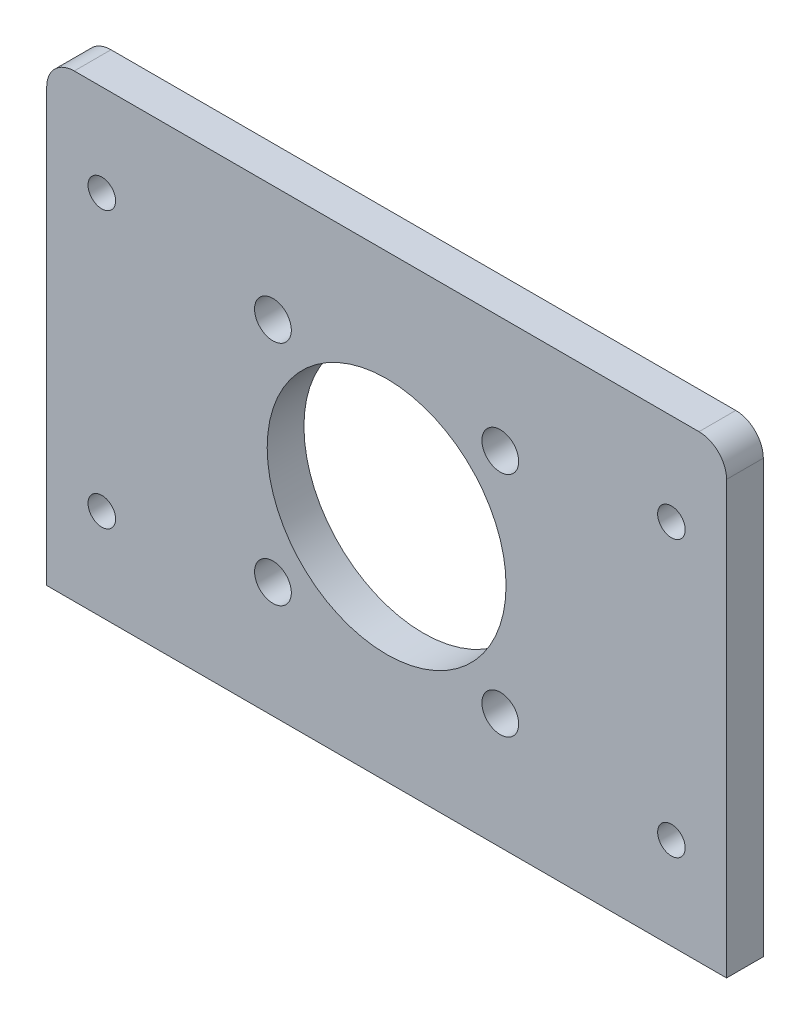
ISO-10303-21;
HEADER;
FILE_DESCRIPTION(('STEP AP214'),'2;1');
FILE_NAME('part.step','',(''),(''),'','','');
FILE_SCHEMA(('AUTOMOTIVE_DESIGN { 1 0 10303 214 1 1 1 1 }'));
ENDSEC;
DATA;
#1=APPLICATION_CONTEXT('core data for automotive mechanical design processes');
#2=APPLICATION_PROTOCOL_DEFINITION('international standard','automotive_design',2000,#1);
#3=PRODUCT_CONTEXT('',#1,'mechanical');
#4=PRODUCT('Part','Part','',(#3));
#5=PRODUCT_RELATED_PRODUCT_CATEGORY('part','',(#4));
#6=PRODUCT_DEFINITION_FORMATION('','',#4);
#7=PRODUCT_DEFINITION_CONTEXT('part definition',#1,'design');
#8=PRODUCT_DEFINITION('design','',#6,#7);
#9=PRODUCT_DEFINITION_SHAPE('','',#8);
#10=(LENGTH_UNIT() NAMED_UNIT(*) SI_UNIT(.MILLI.,.METRE.));
#11=(NAMED_UNIT(*) PLANE_ANGLE_UNIT() SI_UNIT($,.RADIAN.));
#12=(NAMED_UNIT(*) SI_UNIT($,.STERADIAN.) SOLID_ANGLE_UNIT());
#13=UNCERTAINTY_MEASURE_WITH_UNIT(LENGTH_MEASURE(1.E-05),#10,'distance_accuracy_value','');
#14=(GEOMETRIC_REPRESENTATION_CONTEXT(3) GLOBAL_UNCERTAINTY_ASSIGNED_CONTEXT((#13)) GLOBAL_UNIT_ASSIGNED_CONTEXT((#10,
#11,#12)) REPRESENTATION_CONTEXT('',''));
#15=CARTESIAN_POINT('',(0.,0.,0.));
#16=DIRECTION('',(0.,0.,1.));
#17=DIRECTION('',(1.,0.,0.));
#18=AXIS2_PLACEMENT_3D('',#15,#16,#17);
#19=CARTESIAN_POINT('',(37.,-25.,4.));
#20=DIRECTION('',(-1.,0.,0.));
#21=DIRECTION('',(0.,0.,1.));
#22=AXIS2_PLACEMENT_3D('',#19,#20,#21);
#23=PLANE('',#22);
#24=DIRECTION('',(0.,1.,0.));
#25=VECTOR('',#24,1.);
#26=CARTESIAN_POINT('',(37.,-25.,0.));
#27=LINE('',#26,#25);
#28=CARTESIAN_POINT('',(37.,-25.,0.));
#29=VERTEX_POINT('',#28);
#30=CARTESIAN_POINT('',(37.,22.,0.));
#31=VERTEX_POINT('',#30);
#32=EDGE_CURVE('E115',#29,#31,#27,.T.);
#33=ORIENTED_EDGE('',*,*,#32,.T.);
#34=DIRECTION('',(0.,0.,-1.));
#35=VECTOR('',#34,1.);
#36=CARTESIAN_POINT('',(37.,22.,4.));
#37=LINE('',#36,#35);
#38=CARTESIAN_POINT('',(37.,22.,4.));
#39=VERTEX_POINT('',#38);
#40=EDGE_CURVE('E59',#31,#39,#37,.F.);
#41=ORIENTED_EDGE('',*,*,#40,.T.);
#42=DIRECTION('',(0.,1.,0.));
#43=VECTOR('',#42,1.);
#44=CARTESIAN_POINT('',(37.,-25.,4.));
#45=LINE('',#44,#43);
#46=CARTESIAN_POINT('',(37.,-25.,4.));
#47=VERTEX_POINT('',#46);
#48=EDGE_CURVE('E123',#47,#39,#45,.T.);
#49=ORIENTED_EDGE('',*,*,#48,.F.);
#50=DIRECTION('',(0.,0.,-1.));
#51=VECTOR('',#50,1.);
#52=CARTESIAN_POINT('',(37.,-25.,4.));
#53=LINE('',#52,#51);
#54=EDGE_CURVE('E107',#47,#29,#53,.T.);
#55=ORIENTED_EDGE('',*,*,#54,.T.);
#56=EDGE_LOOP('',(#33,#41,#49,#55));
#57=FACE_BOUND('',#56,.T.);
#58=ADVANCED_FACE('F36',(#57),#23,.F.);
#59=CARTESIAN_POINT('',(-37.,25.,4.));
#60=DIRECTION('',(0.,-1.,0.));
#61=DIRECTION('',(0.,0.,-1.));
#62=AXIS2_PLACEMENT_3D('',#59,#60,#61);
#63=PLANE('',#62);
#64=DIRECTION('',(-1.,0.,0.));
#65=VECTOR('',#64,1.);
#66=CARTESIAN_POINT('',(-37.,25.,4.));
#67=LINE('',#66,#65);
#68=CARTESIAN_POINT('',(34.,25.,4.));
#69=VERTEX_POINT('',#68);
#70=CARTESIAN_POINT('',(-34.,25.,4.));
#71=VERTEX_POINT('',#70);
#72=EDGE_CURVE('E97',#69,#71,#67,.T.);
#73=ORIENTED_EDGE('',*,*,#72,.F.);
#74=DIRECTION('',(0.,0.,-1.));
#75=VECTOR('',#74,1.);
#76=CARTESIAN_POINT('',(34.,25.,4.));
#77=LINE('',#76,#75);
#78=CARTESIAN_POINT('',(34.,25.,0.));
#79=VERTEX_POINT('',#78);
#80=EDGE_CURVE('E126',#69,#79,#77,.T.);
#81=ORIENTED_EDGE('',*,*,#80,.T.);
#82=DIRECTION('',(-1.,0.,0.));
#83=VECTOR('',#82,1.);
#84=CARTESIAN_POINT('',(-37.,25.,0.));
#85=LINE('',#84,#83);
#86=CARTESIAN_POINT('',(-34.,25.,0.));
#87=VERTEX_POINT('',#86);
#88=EDGE_CURVE('E117',#79,#87,#85,.T.);
#89=ORIENTED_EDGE('',*,*,#88,.T.);
#90=DIRECTION('',(0.,0.,-1.));
#91=VECTOR('',#90,1.);
#92=CARTESIAN_POINT('',(-34.,25.,4.));
#93=LINE('',#92,#91);
#94=EDGE_CURVE('E106',#87,#71,#93,.F.);
#95=ORIENTED_EDGE('',*,*,#94,.T.);
#96=EDGE_LOOP('',(#73,#81,#89,#95));
#97=FACE_BOUND('',#96,.T.);
#98=ADVANCED_FACE('F139',(#97),#63,.F.);
#99=CARTESIAN_POINT('',(-37.,-25.,4.));
#100=DIRECTION('',(1.,0.,0.));
#101=DIRECTION('',(0.,0.,-1.));
#102=AXIS2_PLACEMENT_3D('',#99,#100,#101);
#103=PLANE('',#102);
#104=DIRECTION('',(0.,-1.,0.));
#105=VECTOR('',#104,1.);
#106=CARTESIAN_POINT('',(-37.,-25.,4.));
#107=LINE('',#106,#105);
#108=CARTESIAN_POINT('',(-37.,22.,4.));
#109=VERTEX_POINT('',#108);
#110=CARTESIAN_POINT('',(-37.,-25.,4.));
#111=VERTEX_POINT('',#110);
#112=EDGE_CURVE('E89',#109,#111,#107,.T.);
#113=ORIENTED_EDGE('',*,*,#112,.F.);
#114=DIRECTION('',(0.,0.,-1.));
#115=VECTOR('',#114,1.);
#116=CARTESIAN_POINT('',(-37.,22.,4.));
#117=LINE('',#116,#115);
#118=CARTESIAN_POINT('',(-37.,22.,0.));
#119=VERTEX_POINT('',#118);
#120=EDGE_CURVE('E11',#109,#119,#117,.T.);
#121=ORIENTED_EDGE('',*,*,#120,.T.);
#122=DIRECTION('',(0.,-1.,0.));
#123=VECTOR('',#122,1.);
#124=CARTESIAN_POINT('',(-37.,-25.,0.));
#125=LINE('',#124,#123);
#126=CARTESIAN_POINT('',(-37.,-25.,0.));
#127=VERTEX_POINT('',#126);
#128=EDGE_CURVE('E103',#119,#127,#125,.T.);
#129=ORIENTED_EDGE('',*,*,#128,.T.);
#130=DIRECTION('',(0.,0.,-1.));
#131=VECTOR('',#130,1.);
#132=CARTESIAN_POINT('',(-37.,-25.,4.));
#133=LINE('',#132,#131);
#134=EDGE_CURVE('E100',#111,#127,#133,.T.);
#135=ORIENTED_EDGE('',*,*,#134,.F.);
#136=EDGE_LOOP('',(#113,#121,#129,#135));
#137=FACE_BOUND('',#136,.T.);
#138=ADVANCED_FACE('F101',(#137),#103,.F.);
#139=CARTESIAN_POINT('',(-37.,-25.,4.));
#140=DIRECTION('',(0.,1.,0.));
#141=DIRECTION('',(0.,0.,1.));
#142=AXIS2_PLACEMENT_3D('',#139,#140,#141);
#143=PLANE('',#142);
#144=DIRECTION('',(1.,0.,0.));
#145=VECTOR('',#144,1.);
#146=CARTESIAN_POINT('',(-37.,-25.,0.));
#147=LINE('',#146,#145);
#148=EDGE_CURVE('E122',#127,#29,#147,.T.);
#149=ORIENTED_EDGE('',*,*,#148,.T.);
#150=ORIENTED_EDGE('',*,*,#54,.F.);
#151=DIRECTION('',(1.,0.,0.));
#152=VECTOR('',#151,1.);
#153=CARTESIAN_POINT('',(-37.,-25.,4.));
#154=LINE('',#153,#152);
#155=EDGE_CURVE('E93',#111,#47,#154,.T.);
#156=ORIENTED_EDGE('',*,*,#155,.F.);
#157=ORIENTED_EDGE('',*,*,#134,.T.);
#158=EDGE_LOOP('',(#149,#150,#156,#157));
#159=FACE_BOUND('',#158,.T.);
#160=ADVANCED_FACE('F109',(#159),#143,.F.);
#161=CARTESIAN_POINT('',(0.,0.,4.));
#162=DIRECTION('',(0.,0.,-1.));
#163=DIRECTION('',(-1.,0.,0.));
#164=AXIS2_PLACEMENT_3D('',#161,#162,#163);
#165=PLANE('',#164);
#166=CARTESIAN_POINT('',(31.,-15.,4.));
#167=DIRECTION('',(0.,0.,1.));
#168=DIRECTION('',(-1.,0.,0.));
#169=AXIS2_PLACEMENT_3D('',#166,#167,#168);
#170=CIRCLE('',#169,1.5);
#171=CARTESIAN_POINT('',(29.5,-15.,4.));
#172=VERTEX_POINT('',#171);
#173=EDGE_CURVE('E196',#172,#172,#170,.T.);
#174=ORIENTED_EDGE('',*,*,#173,.F.);
#175=EDGE_LOOP('',(#174));
#176=FACE_BOUND('',#175,.T.);
#177=CARTESIAN_POINT('',(-31.,-15.,4.));
#178=DIRECTION('',(0.,0.,-1.));
#179=DIRECTION('',(1.,0.,0.));
#180=AXIS2_PLACEMENT_3D('',#177,#178,#179);
#181=CIRCLE('',#180,1.5);
#182=CARTESIAN_POINT('',(-29.5,-15.,4.));
#183=VERTEX_POINT('',#182);
#184=EDGE_CURVE('E190',#183,#183,#181,.T.);
#185=ORIENTED_EDGE('',*,*,#184,.T.);
#186=EDGE_LOOP('',(#185));
#187=FACE_BOUND('',#186,.T.);
#188=CARTESIAN_POINT('',(31.,15.,4.));
#189=DIRECTION('',(0.,0.,-1.));
#190=DIRECTION('',(-1.,0.,0.));
#191=AXIS2_PLACEMENT_3D('',#188,#189,#190);
#192=CIRCLE('',#191,1.5);
#193=CARTESIAN_POINT('',(29.5,15.,4.));
#194=VERTEX_POINT('',#193);
#195=EDGE_CURVE('E184',#194,#194,#192,.T.);
#196=ORIENTED_EDGE('',*,*,#195,.T.);
#197=EDGE_LOOP('',(#196));
#198=FACE_BOUND('',#197,.T.);
#199=CARTESIAN_POINT('',(-31.,15.,4.));
#200=DIRECTION('',(0.,0.,1.));
#201=DIRECTION('',(1.,0.,0.));
#202=AXIS2_PLACEMENT_3D('',#199,#200,#201);
#203=CIRCLE('',#202,1.5);
#204=CARTESIAN_POINT('',(-29.5,15.,4.));
#205=VERTEX_POINT('',#204);
#206=EDGE_CURVE('E178',#205,#205,#203,.T.);
#207=ORIENTED_EDGE('',*,*,#206,.F.);
#208=EDGE_LOOP('',(#207));
#209=FACE_BOUND('',#208,.T.);
#210=CARTESIAN_POINT('',(-12.3743686707646,-12.3743686707646,4.));
#211=DIRECTION('',(0.,0.,1.));
#212=DIRECTION('',(-1.,0.,0.));
#213=AXIS2_PLACEMENT_3D('',#210,#211,#212);
#214=CIRCLE('',#213,2.);
#215=CARTESIAN_POINT('',(-14.3743686707646,-12.3743686707646,4.));
#216=VERTEX_POINT('',#215);
#217=EDGE_CURVE('E172',#216,#216,#214,.T.);
#218=ORIENTED_EDGE('',*,*,#217,.F.);
#219=EDGE_LOOP('',(#218));
#220=FACE_BOUND('',#219,.T.);
#221=CARTESIAN_POINT('',(12.3743686707646,-12.3743686707646,4.));
#222=DIRECTION('',(0.,0.,-1.));
#223=DIRECTION('',(1.,0.,0.));
#224=AXIS2_PLACEMENT_3D('',#221,#222,#223);
#225=CIRCLE('',#224,2.);
#226=CARTESIAN_POINT('',(14.3743686707646,-12.3743686707646,4.));
#227=VERTEX_POINT('',#226);
#228=EDGE_CURVE('E166',#227,#227,#225,.T.);
#229=ORIENTED_EDGE('',*,*,#228,.T.);
#230=EDGE_LOOP('',(#229));
#231=FACE_BOUND('',#230,.T.);
#232=CARTESIAN_POINT('',(-12.3743686707646,12.3743686707646,4.));
#233=DIRECTION('',(0.,0.,-1.));
#234=DIRECTION('',(-1.,0.,0.));
#235=AXIS2_PLACEMENT_3D('',#232,#233,#234);
#236=CIRCLE('',#235,2.);
#237=CARTESIAN_POINT('',(-14.3743686707646,12.3743686707646,4.));
#238=VERTEX_POINT('',#237);
#239=EDGE_CURVE('E160',#238,#238,#236,.T.);
#240=ORIENTED_EDGE('',*,*,#239,.T.);
#241=EDGE_LOOP('',(#240));
#242=FACE_BOUND('',#241,.T.);
#243=CARTESIAN_POINT('',(12.3743686707646,12.3743686707646,4.));
#244=DIRECTION('',(0.,0.,1.));
#245=DIRECTION('',(1.,0.,0.));
#246=AXIS2_PLACEMENT_3D('',#243,#244,#245);
#247=CIRCLE('',#246,2.);
#248=CARTESIAN_POINT('',(14.3743686707646,12.3743686707646,4.));
#249=VERTEX_POINT('',#248);
#250=EDGE_CURVE('E154',#249,#249,#247,.T.);
#251=ORIENTED_EDGE('',*,*,#250,.F.);
#252=EDGE_LOOP('',(#251));
#253=FACE_BOUND('',#252,.T.);
#254=CARTESIAN_POINT('',(0.,0.,4.));
#255=DIRECTION('',(0.,0.,1.));
#256=DIRECTION('',(1.,0.,0.));
#257=AXIS2_PLACEMENT_3D('',#254,#255,#256);
#258=CIRCLE('',#257,13.);
#259=CARTESIAN_POINT('',(13.,0.,4.));
#260=VERTEX_POINT('',#259);
#261=EDGE_CURVE('E148',#260,#260,#258,.T.);
#262=ORIENTED_EDGE('',*,*,#261,.F.);
#263=EDGE_LOOP('',(#262));
#264=FACE_BOUND('',#263,.T.);
#265=ORIENTED_EDGE('',*,*,#48,.T.);
#266=CARTESIAN_POINT('',(34.,22.,4.));
#267=DIRECTION('',(0.,0.,-1.));
#268=DIRECTION('',(-1.,0.,0.));
#269=AXIS2_PLACEMENT_3D('',#266,#267,#268);
#270=CIRCLE('',#269,3.);
#271=EDGE_CURVE('E44',#39,#69,#270,.F.);
#272=ORIENTED_EDGE('',*,*,#271,.T.);
#273=ORIENTED_EDGE('',*,*,#72,.T.);
#274=CARTESIAN_POINT('',(-34.,22.,4.));
#275=DIRECTION('',(0.,0.,-1.));
#276=DIRECTION('',(-1.,0.,0.));
#277=AXIS2_PLACEMENT_3D('',#274,#275,#276);
#278=CIRCLE('',#277,3.);
#279=EDGE_CURVE('E51',#71,#109,#278,.F.);
#280=ORIENTED_EDGE('',*,*,#279,.T.);
#281=ORIENTED_EDGE('',*,*,#112,.T.);
#282=ORIENTED_EDGE('',*,*,#155,.T.);
#283=EDGE_LOOP('',(#265,#272,#273,#280,#281,#282));
#284=FACE_BOUND('',#283,.T.);
#285=ADVANCED_FACE('F91',(#176,#187,#198,#209,#220,#231,#242,#253,#264,#284),#165,.F.);
#286=CARTESIAN_POINT('',(0.,0.,0.));
#287=DIRECTION('',(0.,0.,-1.));
#288=DIRECTION('',(-1.,0.,0.));
#289=AXIS2_PLACEMENT_3D('',#286,#287,#288);
#290=PLANE('',#289);
#291=CARTESIAN_POINT('',(31.,-15.,0.));
#292=DIRECTION('',(0.,0.,1.));
#293=DIRECTION('',(-1.,0.,0.));
#294=AXIS2_PLACEMENT_3D('',#291,#292,#293);
#295=CIRCLE('',#294,1.5);
#296=CARTESIAN_POINT('',(29.5,-15.,0.));
#297=VERTEX_POINT('',#296);
#298=EDGE_CURVE('E193',#297,#297,#295,.T.);
#299=ORIENTED_EDGE('',*,*,#298,.T.);
#300=EDGE_LOOP('',(#299));
#301=FACE_BOUND('',#300,.T.);
#302=CARTESIAN_POINT('',(-31.,-15.,0.));
#303=DIRECTION('',(0.,0.,-1.));
#304=DIRECTION('',(1.,0.,0.));
#305=AXIS2_PLACEMENT_3D('',#302,#303,#304);
#306=CIRCLE('',#305,1.5);
#307=CARTESIAN_POINT('',(-29.5,-15.,0.));
#308=VERTEX_POINT('',#307);
#309=EDGE_CURVE('E187',#308,#308,#306,.T.);
#310=ORIENTED_EDGE('',*,*,#309,.F.);
#311=EDGE_LOOP('',(#310));
#312=FACE_BOUND('',#311,.T.);
#313=CARTESIAN_POINT('',(31.,15.,0.));
#314=DIRECTION('',(0.,0.,-1.));
#315=DIRECTION('',(-1.,0.,0.));
#316=AXIS2_PLACEMENT_3D('',#313,#314,#315);
#317=CIRCLE('',#316,1.5);
#318=CARTESIAN_POINT('',(29.5,15.,0.));
#319=VERTEX_POINT('',#318);
#320=EDGE_CURVE('E181',#319,#319,#317,.T.);
#321=ORIENTED_EDGE('',*,*,#320,.F.);
#322=EDGE_LOOP('',(#321));
#323=FACE_BOUND('',#322,.T.);
#324=CARTESIAN_POINT('',(-31.,15.,0.));
#325=DIRECTION('',(0.,0.,1.));
#326=DIRECTION('',(1.,0.,0.));
#327=AXIS2_PLACEMENT_3D('',#324,#325,#326);
#328=CIRCLE('',#327,1.5);
#329=CARTESIAN_POINT('',(-29.5,15.,0.));
#330=VERTEX_POINT('',#329);
#331=EDGE_CURVE('E175',#330,#330,#328,.T.);
#332=ORIENTED_EDGE('',*,*,#331,.T.);
#333=EDGE_LOOP('',(#332));
#334=FACE_BOUND('',#333,.T.);
#335=CARTESIAN_POINT('',(-12.3743686707646,-12.3743686707646,0.));
#336=DIRECTION('',(0.,0.,1.));
#337=DIRECTION('',(-1.,0.,0.));
#338=AXIS2_PLACEMENT_3D('',#335,#336,#337);
#339=CIRCLE('',#338,2.);
#340=CARTESIAN_POINT('',(-14.3743686707646,-12.3743686707646,0.));
#341=VERTEX_POINT('',#340);
#342=EDGE_CURVE('E169',#341,#341,#339,.T.);
#343=ORIENTED_EDGE('',*,*,#342,.T.);
#344=EDGE_LOOP('',(#343));
#345=FACE_BOUND('',#344,.T.);
#346=CARTESIAN_POINT('',(12.3743686707646,-12.3743686707646,0.));
#347=DIRECTION('',(0.,0.,-1.));
#348=DIRECTION('',(1.,0.,0.));
#349=AXIS2_PLACEMENT_3D('',#346,#347,#348);
#350=CIRCLE('',#349,2.);
#351=CARTESIAN_POINT('',(14.3743686707646,-12.3743686707646,0.));
#352=VERTEX_POINT('',#351);
#353=EDGE_CURVE('E163',#352,#352,#350,.T.);
#354=ORIENTED_EDGE('',*,*,#353,.F.);
#355=EDGE_LOOP('',(#354));
#356=FACE_BOUND('',#355,.T.);
#357=CARTESIAN_POINT('',(-12.3743686707646,12.3743686707646,0.));
#358=DIRECTION('',(0.,0.,-1.));
#359=DIRECTION('',(-1.,0.,0.));
#360=AXIS2_PLACEMENT_3D('',#357,#358,#359);
#361=CIRCLE('',#360,2.);
#362=CARTESIAN_POINT('',(-14.3743686707646,12.3743686707646,0.));
#363=VERTEX_POINT('',#362);
#364=EDGE_CURVE('E157',#363,#363,#361,.T.);
#365=ORIENTED_EDGE('',*,*,#364,.F.);
#366=EDGE_LOOP('',(#365));
#367=FACE_BOUND('',#366,.T.);
#368=CARTESIAN_POINT('',(12.3743686707646,12.3743686707646,0.));
#369=DIRECTION('',(0.,0.,1.));
#370=DIRECTION('',(1.,0.,0.));
#371=AXIS2_PLACEMENT_3D('',#368,#369,#370);
#372=CIRCLE('',#371,2.);
#373=CARTESIAN_POINT('',(14.3743686707646,12.3743686707646,0.));
#374=VERTEX_POINT('',#373);
#375=EDGE_CURVE('E151',#374,#374,#372,.T.);
#376=ORIENTED_EDGE('',*,*,#375,.T.);
#377=EDGE_LOOP('',(#376));
#378=FACE_BOUND('',#377,.T.);
#379=CARTESIAN_POINT('',(0.,0.,0.));
#380=DIRECTION('',(0.,0.,1.));
#381=DIRECTION('',(1.,0.,0.));
#382=AXIS2_PLACEMENT_3D('',#379,#380,#381);
#383=CIRCLE('',#382,13.);
#384=CARTESIAN_POINT('',(13.,0.,0.));
#385=VERTEX_POINT('',#384);
#386=EDGE_CURVE('E118',#385,#385,#383,.T.);
#387=ORIENTED_EDGE('',*,*,#386,.T.);
#388=EDGE_LOOP('',(#387));
#389=FACE_BOUND('',#388,.T.);
#390=ORIENTED_EDGE('',*,*,#88,.F.);
#391=CARTESIAN_POINT('',(34.,22.,0.));
#392=DIRECTION('',(0.,0.,-1.));
#393=DIRECTION('',(-1.,0.,0.));
#394=AXIS2_PLACEMENT_3D('',#391,#392,#393);
#395=CIRCLE('',#394,3.);
#396=EDGE_CURVE('E131',#79,#31,#395,.T.);
#397=ORIENTED_EDGE('',*,*,#396,.T.);
#398=ORIENTED_EDGE('',*,*,#32,.F.);
#399=ORIENTED_EDGE('',*,*,#148,.F.);
#400=ORIENTED_EDGE('',*,*,#128,.F.);
#401=CARTESIAN_POINT('',(-34.,22.,0.));
#402=DIRECTION('',(0.,0.,-1.));
#403=DIRECTION('',(-1.,0.,0.));
#404=AXIS2_PLACEMENT_3D('',#401,#402,#403);
#405=CIRCLE('',#404,3.);
#406=EDGE_CURVE('E129',#119,#87,#405,.T.);
#407=ORIENTED_EDGE('',*,*,#406,.T.);
#408=EDGE_LOOP('',(#390,#397,#398,#399,#400,#407));
#409=FACE_BOUND('',#408,.T.);
#410=ADVANCED_FACE('F145',(#301,#312,#323,#334,#345,#356,#367,#378,#389,#409),#290,.T.);
#411=CARTESIAN_POINT('',(0.,0.,0.));
#412=DIRECTION('',(0.,0.,1.));
#413=DIRECTION('',(1.,0.,0.));
#414=AXIS2_PLACEMENT_3D('',#411,#412,#413);
#415=CYLINDRICAL_SURFACE('',#414,13.);
#416=ORIENTED_EDGE('',*,*,#386,.F.);
#417=EDGE_LOOP('',(#416));
#418=FACE_BOUND('',#417,.T.);
#419=ORIENTED_EDGE('',*,*,#261,.T.);
#420=EDGE_LOOP('',(#419));
#421=FACE_BOUND('',#420,.T.);
#422=ADVANCED_FACE('F230',(#418,#421),#415,.F.);
#423=CARTESIAN_POINT('',(12.3743686707646,12.3743686707646,0.));
#424=DIRECTION('',(0.,0.,1.));
#425=DIRECTION('',(1.,0.,0.));
#426=AXIS2_PLACEMENT_3D('',#423,#424,#425);
#427=CYLINDRICAL_SURFACE('',#426,2.);
#428=ORIENTED_EDGE('',*,*,#375,.F.);
#429=EDGE_LOOP('',(#428));
#430=FACE_BOUND('',#429,.T.);
#431=ORIENTED_EDGE('',*,*,#250,.T.);
#432=EDGE_LOOP('',(#431));
#433=FACE_BOUND('',#432,.T.);
#434=ADVANCED_FACE('F232',(#430,#433),#427,.F.);
#435=CARTESIAN_POINT('',(-12.3743686707646,12.3743686707646,0.));
#436=DIRECTION('',(0.,0.,1.));
#437=DIRECTION('',(1.,0.,0.));
#438=AXIS2_PLACEMENT_3D('',#435,#436,#437);
#439=CYLINDRICAL_SURFACE('',#438,2.);
#440=ORIENTED_EDGE('',*,*,#364,.T.);
#441=EDGE_LOOP('',(#440));
#442=FACE_BOUND('',#441,.T.);
#443=ORIENTED_EDGE('',*,*,#239,.F.);
#444=EDGE_LOOP('',(#443));
#445=FACE_BOUND('',#444,.T.);
#446=ADVANCED_FACE('F239',(#442,#445),#439,.F.);
#447=CARTESIAN_POINT('',(12.3743686707646,-12.3743686707646,0.));
#448=DIRECTION('',(0.,0.,1.));
#449=DIRECTION('',(1.,0.,0.));
#450=AXIS2_PLACEMENT_3D('',#447,#448,#449);
#451=CYLINDRICAL_SURFACE('',#450,2.);
#452=ORIENTED_EDGE('',*,*,#353,.T.);
#453=EDGE_LOOP('',(#452));
#454=FACE_BOUND('',#453,.T.);
#455=ORIENTED_EDGE('',*,*,#228,.F.);
#456=EDGE_LOOP('',(#455));
#457=FACE_BOUND('',#456,.T.);
#458=ADVANCED_FACE('F339',(#454,#457),#451,.F.);
#459=CARTESIAN_POINT('',(-12.3743686707646,-12.3743686707646,0.));
#460=DIRECTION('',(0.,0.,1.));
#461=DIRECTION('',(1.,0.,0.));
#462=AXIS2_PLACEMENT_3D('',#459,#460,#461);
#463=CYLINDRICAL_SURFACE('',#462,2.);
#464=ORIENTED_EDGE('',*,*,#342,.F.);
#465=EDGE_LOOP('',(#464));
#466=FACE_BOUND('',#465,.T.);
#467=ORIENTED_EDGE('',*,*,#217,.T.);
#468=EDGE_LOOP('',(#467));
#469=FACE_BOUND('',#468,.T.);
#470=ADVANCED_FACE('F329',(#466,#469),#463,.F.);
#471=CARTESIAN_POINT('',(-31.,15.,0.));
#472=DIRECTION('',(0.,0.,1.));
#473=DIRECTION('',(1.,0.,0.));
#474=AXIS2_PLACEMENT_3D('',#471,#472,#473);
#475=CYLINDRICAL_SURFACE('',#474,1.5);
#476=ORIENTED_EDGE('',*,*,#331,.F.);
#477=EDGE_LOOP('',(#476));
#478=FACE_BOUND('',#477,.T.);
#479=ORIENTED_EDGE('',*,*,#206,.T.);
#480=EDGE_LOOP('',(#479));
#481=FACE_BOUND('',#480,.T.);
#482=ADVANCED_FACE('F319',(#478,#481),#475,.F.);
#483=CARTESIAN_POINT('',(31.,15.,0.));
#484=DIRECTION('',(0.,0.,1.));
#485=DIRECTION('',(1.,0.,0.));
#486=AXIS2_PLACEMENT_3D('',#483,#484,#485);
#487=CYLINDRICAL_SURFACE('',#486,1.5);
#488=ORIENTED_EDGE('',*,*,#320,.T.);
#489=EDGE_LOOP('',(#488));
#490=FACE_BOUND('',#489,.T.);
#491=ORIENTED_EDGE('',*,*,#195,.F.);
#492=EDGE_LOOP('',(#491));
#493=FACE_BOUND('',#492,.T.);
#494=ADVANCED_FACE('F309',(#490,#493),#487,.F.);
#495=CARTESIAN_POINT('',(-31.,-15.,0.));
#496=DIRECTION('',(0.,0.,1.));
#497=DIRECTION('',(1.,0.,0.));
#498=AXIS2_PLACEMENT_3D('',#495,#496,#497);
#499=CYLINDRICAL_SURFACE('',#498,1.5);
#500=ORIENTED_EDGE('',*,*,#309,.T.);
#501=EDGE_LOOP('',(#500));
#502=FACE_BOUND('',#501,.T.);
#503=ORIENTED_EDGE('',*,*,#184,.F.);
#504=EDGE_LOOP('',(#503));
#505=FACE_BOUND('',#504,.T.);
#506=ADVANCED_FACE('F207',(#502,#505),#499,.F.);
#507=CARTESIAN_POINT('',(31.,-15.,0.));
#508=DIRECTION('',(0.,0.,1.));
#509=DIRECTION('',(1.,0.,0.));
#510=AXIS2_PLACEMENT_3D('',#507,#508,#509);
#511=CYLINDRICAL_SURFACE('',#510,1.5);
#512=ORIENTED_EDGE('',*,*,#298,.F.);
#513=EDGE_LOOP('',(#512));
#514=FACE_BOUND('',#513,.T.);
#515=ORIENTED_EDGE('',*,*,#173,.T.);
#516=EDGE_LOOP('',(#515));
#517=FACE_BOUND('',#516,.T.);
#518=ADVANCED_FACE('F204',(#514,#517),#511,.F.);
#519=CARTESIAN_POINT('',(34.,22.,4.));
#520=DIRECTION('',(0.,0.,-1.));
#521=DIRECTION('',(-1.,0.,0.));
#522=AXIS2_PLACEMENT_3D('',#519,#520,#521);
#523=CYLINDRICAL_SURFACE('',#522,3.);
#524=ORIENTED_EDGE('',*,*,#271,.F.);
#525=ORIENTED_EDGE('',*,*,#40,.F.);
#526=ORIENTED_EDGE('',*,*,#396,.F.);
#527=ORIENTED_EDGE('',*,*,#80,.F.);
#528=EDGE_LOOP('',(#524,#525,#526,#527));
#529=FACE_BOUND('',#528,.T.);
#530=ADVANCED_FACE('F142',(#529),#523,.T.);
#531=CARTESIAN_POINT('',(-34.,22.,4.));
#532=DIRECTION('',(0.,0.,-1.));
#533=DIRECTION('',(-1.,0.,0.));
#534=AXIS2_PLACEMENT_3D('',#531,#532,#533);
#535=CYLINDRICAL_SURFACE('',#534,3.);
#536=ORIENTED_EDGE('',*,*,#279,.F.);
#537=ORIENTED_EDGE('',*,*,#94,.F.);
#538=ORIENTED_EDGE('',*,*,#406,.F.);
#539=ORIENTED_EDGE('',*,*,#120,.F.);
#540=EDGE_LOOP('',(#536,#537,#538,#539));
#541=FACE_BOUND('',#540,.T.);
#542=ADVANCED_FACE('F38',(#541),#535,.T.);
#543=CLOSED_SHELL('',(#58,#98,#138,#160,#285,#410,#422,#434,#446,#458,#470,#482,#494,#506,#518,
#530,#542));
#544=MANIFOLD_SOLID_BREP('B2',#543);
#545=ADVANCED_BREP_SHAPE_REPRESENTATION('',(#18,#544),#14);
#546=SHAPE_DEFINITION_REPRESENTATION(#9,#545);
ENDSEC;
END-ISO-10303-21;
